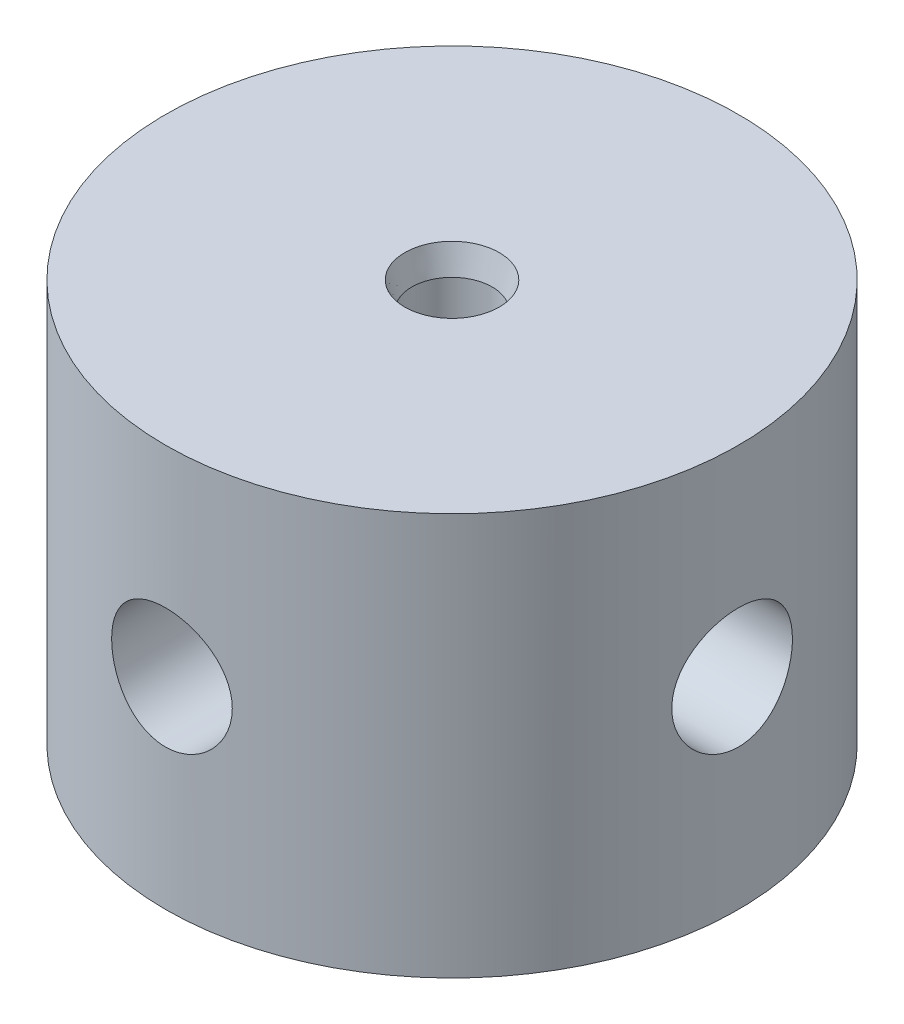
ISO-10303-21;
HEADER;
FILE_DESCRIPTION(('STEP AP214'),'2;1');
FILE_NAME('part.step','',(''),(''),'','','');
FILE_SCHEMA(('AUTOMOTIVE_DESIGN { 1 0 10303 214 1 1 1 1 }'));
ENDSEC;
DATA;
#1=APPLICATION_CONTEXT('core data for automotive mechanical design processes');
#2=APPLICATION_PROTOCOL_DEFINITION('international standard','automotive_design',2000,#1);
#3=PRODUCT_CONTEXT('',#1,'mechanical');
#4=PRODUCT('Part','Part','',(#3));
#5=PRODUCT_RELATED_PRODUCT_CATEGORY('part','',(#4));
#6=PRODUCT_DEFINITION_FORMATION('','',#4);
#7=PRODUCT_DEFINITION_CONTEXT('part definition',#1,'design');
#8=PRODUCT_DEFINITION('design','',#6,#7);
#9=PRODUCT_DEFINITION_SHAPE('','',#8);
#10=(LENGTH_UNIT() NAMED_UNIT(*) SI_UNIT(.MILLI.,.METRE.));
#11=(NAMED_UNIT(*) PLANE_ANGLE_UNIT() SI_UNIT($,.RADIAN.));
#12=(NAMED_UNIT(*) SI_UNIT($,.STERADIAN.) SOLID_ANGLE_UNIT());
#13=UNCERTAINTY_MEASURE_WITH_UNIT(LENGTH_MEASURE(1.E-05),#10,'distance_accuracy_value','');
#14=(GEOMETRIC_REPRESENTATION_CONTEXT(3) GLOBAL_UNCERTAINTY_ASSIGNED_CONTEXT((#13)) GLOBAL_UNIT_ASSIGNED_CONTEXT((#10,
#11,#12)) REPRESENTATION_CONTEXT('',''));
#15=CARTESIAN_POINT('',(0.,0.,0.));
#16=DIRECTION('',(0.,0.,1.));
#17=DIRECTION('',(1.,0.,0.));
#18=AXIS2_PLACEMENT_3D('',#15,#16,#17);
#19=CARTESIAN_POINT('',(0.,7.70570230503482,0.));
#20=DIRECTION('',(0.,1.,0.));
#21=DIRECTION('',(0.,0.,1.));
#22=AXIS2_PLACEMENT_3D('',#19,#20,#21);
#23=CONICAL_SURFACE('',#22,2.,0.261799387799143);
#24=CARTESIAN_POINT('',(0.,9.01192008768396,0.));
#25=DIRECTION('',(0.,1.,0.));
#26=DIRECTION('',(0.,0.,1.));
#27=AXIS2_PLACEMENT_3D('',#24,#25,#26);
#28=CIRCLE('',#27,2.35);
#29=CARTESIAN_POINT('',(0.,9.01192008768396,2.35));
#30=VERTEX_POINT('',#29);
#31=EDGE_CURVE('E89',#30,#30,#28,.T.);
#32=ORIENTED_EDGE('',*,*,#31,.T.);
#33=EDGE_LOOP('',(#32));
#34=FACE_BOUND('',#33,.T.);
#35=CARTESIAN_POINT('',(0.,7.70570230503482,0.));
#36=DIRECTION('',(0.,1.,0.));
#37=DIRECTION('',(0.,0.,1.));
#38=AXIS2_PLACEMENT_3D('',#35,#36,#37);
#39=CIRCLE('',#38,2.);
#40=CARTESIAN_POINT('',(0.,7.70570230503482,2.));
#41=VERTEX_POINT('',#40);
#42=EDGE_CURVE('E101',#41,#41,#39,.T.);
#43=ORIENTED_EDGE('',*,*,#42,.F.);
#44=EDGE_LOOP('',(#43));
#45=FACE_BOUND('',#44,.T.);
#46=ADVANCED_FACE('F31',(#34,#45),#23,.F.);
#47=CARTESIAN_POINT('',(-2.35,9.01192008768396,0.));
#48=DIRECTION('',(0.,1.,0.));
#49=DIRECTION('',(0.,0.,1.));
#50=AXIS2_PLACEMENT_3D('',#47,#48,#49);
#51=PLANE('',#50);
#52=CARTESIAN_POINT('',(0.,9.01192008768396,0.));
#53=DIRECTION('',(0.,1.,0.));
#54=DIRECTION('',(0.,0.,1.));
#55=AXIS2_PLACEMENT_3D('',#52,#53,#54);
#56=CIRCLE('',#55,14.25);
#57=CARTESIAN_POINT('',(0.,9.01192008768396,14.25));
#58=VERTEX_POINT('',#57);
#59=EDGE_CURVE('E92',#58,#58,#56,.T.);
#60=ORIENTED_EDGE('',*,*,#59,.T.);
#61=EDGE_LOOP('',(#60));
#62=FACE_BOUND('',#61,.T.);
#63=ORIENTED_EDGE('',*,*,#31,.F.);
#64=EDGE_LOOP('',(#63));
#65=FACE_BOUND('',#64,.T.);
#66=ADVANCED_FACE('F129',(#62,#65),#51,.T.);
#67=CARTESIAN_POINT('',(0.,20.798274686081,0.));
#68=DIRECTION('',(0.,1.,0.));
#69=DIRECTION('',(0.,0.,1.));
#70=AXIS2_PLACEMENT_3D('',#67,#68,#69);
#71=CYLINDRICAL_SURFACE('',#70,14.25);
#72=CARTESIAN_POINT('',(-3.00000000000005,-0.988079912316035,-13.930631715755));
#73=CARTESIAN_POINT('',(-2.99999407273185,-0.821584479864396,-13.9306350694233));
#74=CARTESIAN_POINT('',(-2.98609252354241,-0.655016304540398,-13.9336490686332));
#75=CARTESIAN_POINT('',(-2.93090795114804,-0.326605720671018,-13.9453592590967));
#76=CARTESIAN_POINT('',(-2.88960418647757,-0.164766988923008,-13.9540597545363));
#77=CARTESIAN_POINT('',(-2.78096413507837,0.149386333124839,-13.9761148771583));
#78=CARTESIAN_POINT('',(-2.71365521140457,0.301710739498108,-13.9894646108851));
#79=CARTESIAN_POINT('',(-2.55499233532879,0.592905119851587,-14.0193081761238));
#80=CARTESIAN_POINT('',(-2.46363925554748,0.731775581857834,-14.035801893527));
#81=CARTESIAN_POINT('',(-2.25795658766702,0.994298790749845,-14.0703635152151));
#82=CARTESIAN_POINT('',(-2.14332210398661,1.11771021327432,-14.0884502868546));
#83=CARTESIAN_POINT('',(-1.8949891381351,1.34370163048866,-14.1239945260068));
#84=CARTESIAN_POINT('',(-1.76128924195898,1.44628007871137,-14.1414519467228));
#85=CARTESIAN_POINT('',(-1.47701156458836,1.62864022199621,-14.1739751058444));
#86=CARTESIAN_POINT('',(-1.32628259484508,1.70819104516815,-14.1890159922531));
#87=CARTESIAN_POINT('',(-1.01322719350428,1.84074586707918,-14.21479878611));
#88=CARTESIAN_POINT('',(-0.850901968122824,1.89375262229081,-14.2255411399167));
#89=CARTESIAN_POINT('',(-0.521769054013513,1.97095909856941,-14.2413831830226));
#90=CARTESIAN_POINT('',(-0.355060987239144,1.99556685123942,-14.2465627205912));
#91=CARTESIAN_POINT('',(-0.0198076685782618,2.01655133138358,-14.2509717954661));
#92=CARTESIAN_POINT('',(0.148737386079496,2.01293106032487,-14.2502019653647));
#93=CARTESIAN_POINT('',(0.480071518580554,1.97786865735904,-14.2428604484779));
#94=CARTESIAN_POINT('',(0.64290945256736,1.94686619860381,-14.2363804530263));
#95=CARTESIAN_POINT('',(0.961018532741792,1.85861864055113,-14.2184506837522));
#96=CARTESIAN_POINT('',(1.11628935351906,1.80137241378643,-14.2070006964133));
#97=CARTESIAN_POINT('',(1.41609228375931,1.66186520665428,-14.180268362604));
#98=CARTESIAN_POINT('',(1.56054328432608,1.57943506614312,-14.1649602266178));
#99=CARTESIAN_POINT('',(1.83372413747655,1.39202561520243,-14.1321942006922));
#100=CARTESIAN_POINT('',(1.9624519932724,1.28704344539984,-14.1147360382706));
#101=CARTESIAN_POINT('',(2.20314494546534,1.05510799794787,-14.0791960848749));
#102=CARTESIAN_POINT('',(2.31473871266244,0.927769899734075,-14.0611087605331));
#103=CARTESIAN_POINT('',(2.51505310201785,0.656001598966922,-14.0266663568076));
#104=CARTESIAN_POINT('',(2.6037731927548,0.511570999419274,-14.0103113176752));
#105=CARTESIAN_POINT('',(2.75597009651015,0.209147377700451,-13.981172245478));
#106=CARTESIAN_POINT('',(2.81938126333301,0.051120361783404,-13.9683975242318));
#107=CARTESIAN_POINT('',(2.91863920179107,-0.273677852748964,-13.9479976801258));
#108=CARTESIAN_POINT('',(2.95448999266834,-0.440447772560281,-13.9403718064083));
#109=CARTESIAN_POINT('',(2.99704298467467,-0.774617130201403,-13.9312850369798));
#110=CARTESIAN_POINT('',(3.00428387028938,-0.941944952893327,-13.9297102240784));
#111=CARTESIAN_POINT('',(2.99086596152107,-1.27541705777999,-13.9325972645622));
#112=CARTESIAN_POINT('',(2.97020893245215,-1.44156141419293,-13.9370587359856));
#113=CARTESIAN_POINT('',(2.90204763754515,-1.76610394559504,-13.9514084749644));
#114=CARTESIAN_POINT('',(2.85483608001637,-1.92456645335632,-13.9612375421685));
#115=CARTESIAN_POINT('',(2.73522104221618,-2.23133220226323,-13.9851622510167));
#116=CARTESIAN_POINT('',(2.66281529884392,-2.37963452932444,-13.9992582759311));
#117=CARTESIAN_POINT('',(2.49366584734068,-2.66421298589082,-14.0303814452717));
#118=CARTESIAN_POINT('',(2.39658795441122,-2.80028611406093,-14.0474477309783));
#119=CARTESIAN_POINT('',(2.18129081640063,-3.05440770695595,-14.0824834094133));
#120=CARTESIAN_POINT('',(2.06306914825927,-3.17245410295399,-14.100452905479));
#121=CARTESIAN_POINT('',(1.80641133549868,-3.38924045197978,-14.1356432219504));
#122=CARTESIAN_POINT('',(1.66766322576946,-3.48761449486815,-14.1528459123941));
#123=CARTESIAN_POINT('',(1.37529727784636,-3.65965656177768,-14.1842391773599));
#124=CARTESIAN_POINT('',(1.22168010527678,-3.73332569107352,-14.1984298866247));
#125=CARTESIAN_POINT('',(0.904855274272693,-3.85334644673233,-14.2221233894864));
#126=CARTESIAN_POINT('',(0.741712482240362,-3.89986346129369,-14.231654506413));
#127=CARTESIAN_POINT('',(0.40970624090926,-3.96477960830722,-14.2450769586453));
#128=CARTESIAN_POINT('',(0.240843562060605,-3.98318251236515,-14.2489690504422));
#129=CARTESIAN_POINT('',(-0.0943259629639137,-3.99118896600825,-14.2506545057702));
#130=CARTESIAN_POINT('',(-0.260619374818223,-3.98134051011501,-14.2485639178517));
#131=CARTESIAN_POINT('',(-0.589124475083912,-3.93434247631924,-14.2387654654102));
#132=CARTESIAN_POINT('',(-0.751336226589696,-3.89719332070007,-14.2310576877731));
#133=CARTESIAN_POINT('',(-1.06668635807138,-3.79690267570119,-14.2108971315503));
#134=CARTESIAN_POINT('',(-1.21984867240174,-3.73383361676328,-14.1984575825559));
#135=CARTESIAN_POINT('',(-1.51349270412333,-3.58356622499668,-14.1701667219788));
#136=CARTESIAN_POINT('',(-1.65397328909193,-3.4963657401588,-14.1543151061404));
#137=CARTESIAN_POINT('',(-1.92095580956016,-3.29849623847961,-14.1205834502782));
#138=CARTESIAN_POINT('',(-2.04716599961986,-3.18743881198926,-14.1026724491366));
#139=CARTESIAN_POINT('',(-2.27934648720456,-2.94579807504841,-14.0670149775653));
#140=CARTESIAN_POINT('',(-2.38531194165915,-2.8152101056685,-14.0492685474691));
#141=CARTESIAN_POINT('',(-2.57523141623086,-2.53630360327344,-14.0157098350715));
#142=CARTESIAN_POINT('',(-2.65890154128328,-2.38778844032834,-13.9999237506872));
#143=CARTESIAN_POINT('',(-2.79996396176601,-2.07850943086071,-13.972398057534));
#144=CARTESIAN_POINT('',(-2.85737921903871,-1.91775643134492,-13.9606549151405));
#145=CARTESIAN_POINT('',(-2.93365323653366,-1.62863586204564,-13.9447939519178));
#146=CARTESIAN_POINT('',(-2.95848701414074,-1.50187425432427,-13.9395173008137));
#147=CARTESIAN_POINT('',(-2.99166234709938,-1.2461162376573,-13.9324349558807));
#148=CARTESIAN_POINT('',(-3.00000459384829,-1.11711992262917,-13.9306291165403));
#149=CARTESIAN_POINT('',(-3.00000000000005,-0.988079912316035,-13.930631715755));
#150=B_SPLINE_CURVE_WITH_KNOTS('',3,(#72,#73,#74,#75,#76,#77,#78,#79,#80,#81,#82,#83,#84,#85,
#86,#87,#88,#89,#90,#91,#92,#93,#94,#95,#96,#97,#98,#99,#100,#101,#102,#103,#104,#105,#106,#107,
#108,#109,#110,#111,#112,#113,#114,#115,#116,#117,#118,#119,#120,#121,#122,#123,#124,#125,#126,
#127,#128,#129,#130,#131,#132,#133,#134,#135,#136,#137,#138,#139,#140,#141,#142,#143,#144,#145,
#146,#147,#148,#149),.UNSPECIFIED.,.T.,.F.,(4,2,2,2,2,2,2,2,2,2,2,2,2,2,2,2,2,2,2,2,2,2,2,2,2,2,
2,2,2,2,2,2,2,2,2,2,2,2,4),(0.,0.499013580051084,0.998405308355624,1.49727299331846,
1.99612257566095,2.50198365804439,3.00788227764318,3.51868998702156,4.02944464049469,
4.53276573586809,5.03603331417135,5.53136396516304,6.02671589821407,6.52547111639667,
7.02428960914467,7.53273204167442,8.04118628572137,8.55095091695637,9.06064119302525,
9.56068764222809,10.0607024511563,10.5553107117371,11.0499634126291,11.5517109349612,
12.0535159940564,12.5639288263015,13.0743188201072,13.5815665933708,14.0887463116029,
14.5861551220043,15.0835562387187,15.5795767703218,16.0756415506538,16.5804948480431,
17.0854687687337,17.5965948233673,18.1072730011103,18.4940428743956,18.8807965322468),.UNSPECIFIED.);
#151=CARTESIAN_POINT('',(-3.00000000000005,-0.988079912316035,-13.930631715755));
#152=VERTEX_POINT('',#151);
#153=EDGE_CURVE('E10',#152,#152,#150,.T.);
#154=ORIENTED_EDGE('',*,*,#153,.F.);
#155=EDGE_LOOP('',(#154));
#156=FACE_BOUND('',#155,.T.);
#157=CARTESIAN_POINT('',(-13.930631715755,-0.988079912316035,3.));
#158=CARTESIAN_POINT('',(-13.9306350694233,-0.821584479864396,2.9999940727318));
#159=CARTESIAN_POINT('',(-13.9336490686332,-0.655016304540398,2.98609252354236));
#160=CARTESIAN_POINT('',(-13.9453592590967,-0.326605720671018,2.930907951148));
#161=CARTESIAN_POINT('',(-13.9540597545363,-0.164766988923008,2.88960418647752));
#162=CARTESIAN_POINT('',(-13.9761148771583,0.149386333124839,2.78096413507833));
#163=CARTESIAN_POINT('',(-13.9894646108851,0.301710739498109,2.71365521140452));
#164=CARTESIAN_POINT('',(-14.0193081761239,0.592905119851587,2.55499233532875));
#165=CARTESIAN_POINT('',(-14.035801893527,0.731775581857835,2.46363925554743));
#166=CARTESIAN_POINT('',(-14.0703635152151,0.994298790749846,2.25795658766697));
#167=CARTESIAN_POINT('',(-14.0884502868546,1.11771021327433,2.14332210398656));
#168=CARTESIAN_POINT('',(-14.1239945260068,1.34370163048866,1.89498913813505));
#169=CARTESIAN_POINT('',(-14.1414519467228,1.44628007871137,1.76128924195893));
#170=CARTESIAN_POINT('',(-14.1739751058444,1.62864022199621,1.47701156458831));
#171=CARTESIAN_POINT('',(-14.1890159922531,1.70819104516814,1.32628259484503));
#172=CARTESIAN_POINT('',(-14.21479878611,1.84074586707918,1.01322719350423));
#173=CARTESIAN_POINT('',(-14.2255411399167,1.89375262229081,0.850901968122774));
#174=CARTESIAN_POINT('',(-14.2413831830226,1.97095909856941,0.521769054013463));
#175=CARTESIAN_POINT('',(-14.2465627205912,1.99556685123942,0.355060987239094));
#176=CARTESIAN_POINT('',(-14.2509717954661,2.01655133138358,0.0198076685782125));
#177=CARTESIAN_POINT('',(-14.2502019653647,2.01293106032487,-0.148737386079545));
#178=CARTESIAN_POINT('',(-14.2428604484779,1.97786865735904,-0.480071518580603));
#179=CARTESIAN_POINT('',(-14.2363804530263,1.94686619860381,-0.642909452567409));
#180=CARTESIAN_POINT('',(-14.2184506837522,1.85861864055113,-0.96101853274184));
#181=CARTESIAN_POINT('',(-14.2070006964132,1.80137241378643,-1.11628935351911));
#182=CARTESIAN_POINT('',(-14.180268362604,1.66186520665428,-1.41609228375936));
#183=CARTESIAN_POINT('',(-14.1649602266178,1.57943506614312,-1.56054328432613));
#184=CARTESIAN_POINT('',(-14.1321942006921,1.39202561520243,-1.8337241374766));
#185=CARTESIAN_POINT('',(-14.1147360382706,1.28704344539984,-1.96245199327245));
#186=CARTESIAN_POINT('',(-14.0791960848749,1.05510799794787,-2.20314494546539));
#187=CARTESIAN_POINT('',(-14.0611087605331,0.927769899734076,-2.31473871266249));
#188=CARTESIAN_POINT('',(-14.0266663568076,0.656001598966924,-2.5150531020179));
#189=CARTESIAN_POINT('',(-14.0103113176752,0.511570999419275,-2.60377319275485));
#190=CARTESIAN_POINT('',(-13.981172245478,0.209147377700452,-2.7559700965102));
#191=CARTESIAN_POINT('',(-13.9683975242318,0.0511203617834047,-2.81938126333306));
#192=CARTESIAN_POINT('',(-13.9479976801258,-0.273677852748963,-2.91863920179112));
#193=CARTESIAN_POINT('',(-13.9403718064083,-0.44044777256028,-2.95448999266839));
#194=CARTESIAN_POINT('',(-13.9312850369798,-0.7746171302014,-2.99704298467472));
#195=CARTESIAN_POINT('',(-13.9297102240784,-0.941944952893325,-3.00428387028943));
#196=CARTESIAN_POINT('',(-13.9325972645622,-1.27541705777999,-2.99086596152112));
#197=CARTESIAN_POINT('',(-13.9370587359856,-1.44156141419293,-2.9702089324522));
#198=CARTESIAN_POINT('',(-13.9514084749644,-1.76610394559503,-2.9020476375452));
#199=CARTESIAN_POINT('',(-13.9612375421685,-1.92456645335632,-2.85483608001642));
#200=CARTESIAN_POINT('',(-13.9851622510167,-2.23133220226322,-2.73522104221623));
#201=CARTESIAN_POINT('',(-13.9992582759311,-2.37963452932444,-2.66281529884397));
#202=CARTESIAN_POINT('',(-14.0303814452717,-2.66421298589082,-2.49366584734073));
#203=CARTESIAN_POINT('',(-14.0474477309783,-2.80028611406092,-2.39658795441127));
#204=CARTESIAN_POINT('',(-14.0824834094133,-3.05440770695595,-2.18129081640068));
#205=CARTESIAN_POINT('',(-14.100452905479,-3.17245410295399,-2.06306914825932));
#206=CARTESIAN_POINT('',(-14.1356432219504,-3.38924045197978,-1.80641133549873));
#207=CARTESIAN_POINT('',(-14.1528459123941,-3.48761449486815,-1.66766322576951));
#208=CARTESIAN_POINT('',(-14.1842391773599,-3.65965656177767,-1.37529727784641));
#209=CARTESIAN_POINT('',(-14.1984298866247,-3.73332569107352,-1.22168010527683));
#210=CARTESIAN_POINT('',(-14.2221233894864,-3.85334644673233,-0.904855274272744));
#211=CARTESIAN_POINT('',(-14.231654506413,-3.89986346129369,-0.741712482240413));
#212=CARTESIAN_POINT('',(-14.2450769586453,-3.96477960830722,-0.409706240909311));
#213=CARTESIAN_POINT('',(-14.2489690504422,-3.98318251236515,-0.240843562060656));
#214=CARTESIAN_POINT('',(-14.2506545057702,-3.99118896600825,0.094325962963862));
#215=CARTESIAN_POINT('',(-14.2485639178517,-3.98134051011501,0.260619374818172));
#216=CARTESIAN_POINT('',(-14.2387654654102,-3.93434247631924,0.58912447508386));
#217=CARTESIAN_POINT('',(-14.2310576877731,-3.89719332070007,0.751336226589644));
#218=CARTESIAN_POINT('',(-14.2108971315503,-3.7969026757012,1.06668635807133));
#219=CARTESIAN_POINT('',(-14.1984575825559,-3.73383361676328,1.21984867240169));
#220=CARTESIAN_POINT('',(-14.1701667219788,-3.58356622499668,1.51349270412328));
#221=CARTESIAN_POINT('',(-14.1543151061404,-3.4963657401588,1.65397328909188));
#222=CARTESIAN_POINT('',(-14.1205834502782,-3.29849623847962,1.92095580956011));
#223=CARTESIAN_POINT('',(-14.1026724491366,-3.18743881198926,2.04716599961981));
#224=CARTESIAN_POINT('',(-14.0670149775653,-2.94579807504842,2.2793464872045));
#225=CARTESIAN_POINT('',(-14.0492685474691,-2.8152101056685,2.3853119416591));
#226=CARTESIAN_POINT('',(-14.0157098350715,-2.53630360327345,2.57523141623081));
#227=CARTESIAN_POINT('',(-13.9999237506872,-2.38778844032834,2.65890154128322));
#228=CARTESIAN_POINT('',(-13.972398057534,-2.07850943086072,2.79996396176596));
#229=CARTESIAN_POINT('',(-13.9606549151405,-1.91775643134492,2.85737921903866));
#230=CARTESIAN_POINT('',(-13.9447939519178,-1.62863586204564,2.93365323653361));
#231=CARTESIAN_POINT('',(-13.9395173008137,-1.50187425432428,2.95848701414069));
#232=CARTESIAN_POINT('',(-13.9324349558807,-1.24611623765731,2.99166234709933));
#233=CARTESIAN_POINT('',(-13.9306291165403,-1.11711992262917,3.00000459384824));
#234=CARTESIAN_POINT('',(-13.930631715755,-0.988079912316035,3.));
#235=B_SPLINE_CURVE_WITH_KNOTS('',3,(#157,#158,#159,#160,#161,#162,#163,#164,#165,#166,#167,
#168,#169,#170,#171,#172,#173,#174,#175,#176,#177,#178,#179,#180,#181,#182,#183,#184,#185,#186,
#187,#188,#189,#190,#191,#192,#193,#194,#195,#196,#197,#198,#199,#200,#201,#202,#203,#204,#205,
#206,#207,#208,#209,#210,#211,#212,#213,#214,#215,#216,#217,#218,#219,#220,#221,#222,#223,#224,
#225,#226,#227,#228,#229,#230,#231,#232,#233,#234),.UNSPECIFIED.,.T.,.F.,(4,2,2,2,2,2,2,2,2,2,2,
2,2,2,2,2,2,2,2,2,2,2,2,2,2,2,2,2,2,2,2,2,2,2,2,2,2,2,4),(0.,0.499013580051084,
0.998405308355624,1.49727299331846,1.99612257566095,2.50198365804439,3.00788227764318,
3.51868998702156,4.02944464049469,4.53276573586809,5.03603331417135,5.53136396516304,
6.02671589821406,6.52547111639667,7.02428960914467,7.53273204167442,8.04118628572136,
8.55095091695637,9.06064119302525,9.56068764222808,10.0607024511563,10.5553107117371,
11.0499634126291,11.5517109349612,12.0535159940564,12.5639288263015,13.0743188201072,
13.5815665933708,14.0887463116028,14.5861551220043,15.0835562387187,15.5795767703218,
16.0756415506538,16.5804948480431,17.0854687687337,17.5965948233673,18.1072730011103,
18.4940428743956,18.8807965322468),.UNSPECIFIED.);
#236=CARTESIAN_POINT('',(-13.930631715755,-0.988079912316035,3.));
#237=VERTEX_POINT('',#236);
#238=EDGE_CURVE('E41',#237,#237,#235,.T.);
#239=ORIENTED_EDGE('',*,*,#238,.F.);
#240=EDGE_LOOP('',(#239));
#241=FACE_BOUND('',#240,.T.);
#242=CARTESIAN_POINT('',(0.,-3.98807991231604,14.25));
#243=CARTESIAN_POINT('',(0.166541537110377,-3.9880740191788,14.2499969169943));
#244=CARTESIAN_POINT('',(0.33315572954686,-3.97416503119347,14.2470506101673));
#245=CARTESIAN_POINT('',(0.661661846516614,-3.91894823597891,14.2355816081482));
#246=CARTESIAN_POINT('',(0.82355013232205,-3.87761986925357,14.2270547286168));
#247=CARTESIAN_POINT('',(1.13780843153495,-3.76890789935218,14.2053752165545));
#248=CARTESIAN_POINT('',(1.29018784087872,-3.70155050518824,14.1922272382771));
#249=CARTESIAN_POINT('',(1.58147504334523,-3.54277335245951,14.1627291587602));
#250=CARTESIAN_POINT('',(1.7203833865114,-3.45135457692287,14.1463791883451));
#251=CARTESIAN_POINT('',(1.98286658497172,-3.24560438694884,14.1119990985041));
#252=CARTESIAN_POINT('',(2.10621147716549,-3.13098283952237,14.0939494300954));
#253=CARTESIAN_POINT('',(2.33207370137345,-2.88270403449109,14.0583439878926));
#254=CARTESIAN_POINT('',(2.43458928269985,-2.74904517841954,14.0407882557203));
#255=CARTESIAN_POINT('',(2.61688141997284,-2.46480619124578,14.0079665337392));
#256=CARTESIAN_POINT('',(2.69641616149995,-2.31406782044963,13.9927256416312));
#257=CARTESIAN_POINT('',(2.82893869363976,-2.00099211462074,13.9665385432927));
#258=CARTESIAN_POINT('',(2.88192940895821,-1.83865605971109,13.9555918639408));
#259=CARTESIAN_POINT('',(2.95910567697577,-1.50947869422066,13.939431150953));
#260=CARTESIAN_POINT('',(2.98369675724527,-1.34273650136098,13.9341364952718));
#261=CARTESIAN_POINT('',(3.00463605190015,-1.00741552689891,13.9296369439431));
#262=CARTESIAN_POINT('',(3.00098747442181,-0.838836956089055,13.9304313565534));
#263=CARTESIAN_POINT('',(2.96587805197879,-0.507621726993377,13.9379470751783));
#264=CARTESIAN_POINT('',(2.93488549448466,-0.344932824077677,13.944568582696));
#265=CARTESIAN_POINT('',(2.84670855903369,-0.0271165926352235,13.9628349197759));
#266=CARTESIAN_POINT('',(2.78952280910326,0.128010339331974,13.9744800124667));
#267=CARTESIAN_POINT('',(2.65014513786708,0.427630413880438,14.0015814064261));
#268=CARTESIAN_POINT('',(2.56777067374655,0.572036035113901,14.017065367634));
#269=CARTESIAN_POINT('',(2.38048243086389,0.845149276629205,14.0500825319901));
#270=CARTESIAN_POINT('',(2.27556579480883,0.97385490364095,14.0676159947907));
#271=CARTESIAN_POINT('',(2.04367978902858,1.21461351030631,14.1031866512733));
#272=CARTESIAN_POINT('',(1.91631154618318,1.32628221709948,14.1212269085634));
#273=CARTESIAN_POINT('',(1.64445525927998,1.52673384625625,14.1554585365818));
#274=CARTESIAN_POINT('',(1.49996694780605,1.61551641106862,14.1716498784223));
#275=CARTESIAN_POINT('',(1.19752191990473,1.76775973167511,14.2004059825869));
#276=CARTESIAN_POINT('',(1.03954062073083,1.83117301948902,14.2129639345088));
#277=CARTESIAN_POINT('',(0.714842583634358,1.93044892017468,14.2329872639561));
#278=CARTESIAN_POINT('',(0.548127023805364,1.96631523846608,14.2404533263905));
#279=CARTESIAN_POINT('',(0.213991768716062,2.00892684727819,14.2493551082051));
#280=CARTESIAN_POINT('',(0.0466418821643147,2.01619748342876,14.2508996021877));
#281=CARTESIAN_POINT('',(-0.286881252007021,2.00283118318597,14.2480878367658));
#282=CARTESIAN_POINT('',(-0.453054572619357,1.98219599355968,14.2437319466963));
#283=CARTESIAN_POINT('',(-0.77778742790824,1.91403983157266,14.2296772315481));
#284=CARTESIAN_POINT('',(-0.936406787534411,1.86679172299681,14.2200326577882));
#285=CARTESIAN_POINT('',(-1.24347024534595,1.7470516833623,14.1964790234462));
#286=CARTESIAN_POINT('',(-1.39191352075282,1.6745577139458,14.1825696185314));
#287=CARTESIAN_POINT('',(-1.67660282086847,1.50527046847169,14.151759590255));
#288=CARTESIAN_POINT('',(-1.81265913123308,1.40816512862925,14.134821444206));
#289=CARTESIAN_POINT('',(-2.06673421405954,1.19282560948012,14.0999143839684));
#290=CARTESIAN_POINT('',(-2.18475082481827,1.07458890167134,14.0819453466021));
#291=CARTESIAN_POINT('',(-2.40145142835673,0.817940551052483,14.0466300400284));
#292=CARTESIAN_POINT('',(-2.49977299949404,0.679220339845856,14.0292995329839));
#293=CARTESIAN_POINT('',(-2.67172307298231,0.386926258736484,13.9975737923331));
#294=CARTESIAN_POINT('',(-2.74535261289916,0.233353013311766,13.9831784354011));
#295=CARTESIAN_POINT('',(-2.86535107342834,-0.0834824830270061,13.9590835341467));
#296=CARTESIAN_POINT('',(-2.91186854405661,-0.246686435609178,13.9493584535498));
#297=CARTESIAN_POINT('',(-2.97676496342319,-0.578823391289108,13.9356553622011));
#298=CARTESIAN_POINT('',(-2.99514803454043,-0.747755551355617,13.9316765094909));
#299=CARTESIAN_POINT('',(-3.00308852758949,-1.08290650281042,13.929966628784));
#300=CARTESIAN_POINT('',(-2.99321966856087,-1.2491113278271,13.932111247594));
#301=CARTESIAN_POINT('',(-2.94621169242545,-1.57743376723272,13.9421269515388));
#302=CARTESIAN_POINT('',(-2.90907284904207,-1.73955142262987,13.9499979791944));
#303=CARTESIAN_POINT('',(-2.80884694961555,-2.05468248914857,13.9705212377295));
#304=CARTESIAN_POINT('',(-2.74583751325376,-2.20772158011523,13.9831591573303));
#305=CARTESIAN_POINT('',(-2.59572800595638,-2.50114346193073,14.0117989214057));
#306=CARTESIAN_POINT('',(-2.5086256411844,-2.64152504599702,14.0278010861481));
#307=CARTESIAN_POINT('',(-2.31087450528686,-2.90848814202123,14.0617418217277));
#308=CARTESIAN_POINT('',(-2.1998143863587,-3.0347611034465,14.0797111056862));
#309=CARTESIAN_POINT('',(-1.95814113619446,-3.26706697864975,14.1153488491848));
#310=CARTESIAN_POINT('',(-1.82752350639616,-3.37309522299666,14.1330172384697));
#311=CARTESIAN_POINT('',(-1.54858348059118,-3.56309540969711,14.1663096766607));
#312=CARTESIAN_POINT('',(-1.4000699765315,-3.64679168753194,14.1819070783792));
#313=CARTESIAN_POINT('',(-1.09079180710252,-3.78790343928444,14.2090352755561));
#314=CARTESIAN_POINT('',(-0.930037904806181,-3.84534169775709,14.2205695946224));
#315=CARTESIAN_POINT('',(-0.640858885658901,-3.92166995373646,14.2361315560418));
#316=CARTESIAN_POINT('',(-0.514036351019267,-3.94652758853575,14.2413008144957));
#317=CARTESIAN_POINT('',(-0.25815704003422,-3.97973453495863,14.2482361660742));
#318=CARTESIAN_POINT('',(-0.12910034968661,-3.98808448058225,14.250002389897));
#319=CARTESIAN_POINT('',(0.,-3.98807991231604,14.25));
#320=B_SPLINE_CURVE_WITH_KNOTS('',3,(#242,#243,#244,#245,#246,#247,#248,#249,#250,#251,#252,
#253,#254,#255,#256,#257,#258,#259,#260,#261,#262,#263,#264,#265,#266,#267,#268,#269,#270,#271,
#272,#273,#274,#275,#276,#277,#278,#279,#280,#281,#282,#283,#284,#285,#286,#287,#288,#289,#290,
#291,#292,#293,#294,#295,#296,#297,#298,#299,#300,#301,#302,#303,#304,#305,#306,#307,#308,#309,
#310,#311,#312,#313,#314,#315,#316,#317,#318,#319),.UNSPECIFIED.,.T.,.F.,(4,2,2,2,2,2,2,2,2,2,2,
2,2,2,2,2,2,2,2,2,2,2,2,2,2,2,2,2,2,2,2,2,2,2,2,2,2,2,4),(0.,0.499152175546915,0.99867904714604,
1.49770424288387,1.99670905410247,2.50238879598809,3.00811102230727,3.51897553623579,
4.02978374908917,4.53320408629235,5.03656723380293,5.53147367137181,6.02640603461657,
6.52501377627615,7.02368475539701,7.53232315299178,8.04096949658586,8.5505631569658,
9.06008825847123,9.56020764245239,10.0602957228753,10.5553473403696,11.0504389377396,
11.5521530284449,12.0539271926631,12.5642242165084,13.0744997948458,13.5819525758305,
14.089330995427,14.5864794863132,15.0836229871223,15.5792856803964,16.0749955809124,
16.5800116441855,17.0851440487547,17.5962501118787,18.1069118333465,18.4938615193156,
18.8807963436725),.UNSPECIFIED.);
#321=CARTESIAN_POINT('',(0.,-3.98807991231604,14.25));
#322=VERTEX_POINT('',#321);
#323=EDGE_CURVE('E45',#322,#322,#320,.T.);
#324=ORIENTED_EDGE('',*,*,#323,.F.);
#325=EDGE_LOOP('',(#324));
#326=FACE_BOUND('',#325,.T.);
#327=CARTESIAN_POINT('',(13.930631715755,-0.988079912316035,-3.));
#328=CARTESIAN_POINT('',(13.9306350694233,-0.821584479864396,-2.9999940727318));
#329=CARTESIAN_POINT('',(13.9336490686332,-0.655016304540398,-2.98609252354236));
#330=CARTESIAN_POINT('',(13.9453592590967,-0.326605720671018,-2.930907951148));
#331=CARTESIAN_POINT('',(13.9540597545363,-0.164766988923008,-2.88960418647752));
#332=CARTESIAN_POINT('',(13.9761148771583,0.149386333124839,-2.78096413507833));
#333=CARTESIAN_POINT('',(13.9894646108851,0.301710739498109,-2.71365521140452));
#334=CARTESIAN_POINT('',(14.0193081761239,0.592905119851587,-2.55499233532875));
#335=CARTESIAN_POINT('',(14.035801893527,0.731775581857835,-2.46363925554743));
#336=CARTESIAN_POINT('',(14.0703635152151,0.994298790749846,-2.25795658766697));
#337=CARTESIAN_POINT('',(14.0884502868546,1.11771021327433,-2.14332210398656));
#338=CARTESIAN_POINT('',(14.1239945260068,1.34370163048866,-1.89498913813505));
#339=CARTESIAN_POINT('',(14.1414519467228,1.44628007871137,-1.76128924195893));
#340=CARTESIAN_POINT('',(14.1739751058444,1.62864022199621,-1.47701156458831));
#341=CARTESIAN_POINT('',(14.1890159922531,1.70819104516814,-1.32628259484503));
#342=CARTESIAN_POINT('',(14.21479878611,1.84074586707918,-1.01322719350423));
#343=CARTESIAN_POINT('',(14.2255411399167,1.89375262229081,-0.850901968122774));
#344=CARTESIAN_POINT('',(14.2413831830226,1.97095909856941,-0.521769054013463));
#345=CARTESIAN_POINT('',(14.2465627205912,1.99556685123942,-0.355060987239094));
#346=CARTESIAN_POINT('',(14.2509717954661,2.01655133138358,-0.0198076685782125));
#347=CARTESIAN_POINT('',(14.2502019653647,2.01293106032487,0.148737386079545));
#348=CARTESIAN_POINT('',(14.2428604484779,1.97786865735904,0.480071518580603));
#349=CARTESIAN_POINT('',(14.2363804530263,1.94686619860381,0.642909452567409));
#350=CARTESIAN_POINT('',(14.2184506837522,1.85861864055113,0.96101853274184));
#351=CARTESIAN_POINT('',(14.2070006964132,1.80137241378643,1.11628935351911));
#352=CARTESIAN_POINT('',(14.180268362604,1.66186520665428,1.41609228375936));
#353=CARTESIAN_POINT('',(14.1649602266178,1.57943506614312,1.56054328432613));
#354=CARTESIAN_POINT('',(14.1321942006921,1.39202561520243,1.8337241374766));
#355=CARTESIAN_POINT('',(14.1147360382706,1.28704344539984,1.96245199327245));
#356=CARTESIAN_POINT('',(14.0791960848749,1.05510799794787,2.20314494546539));
#357=CARTESIAN_POINT('',(14.0611087605331,0.927769899734076,2.31473871266249));
#358=CARTESIAN_POINT('',(14.0266663568076,0.656001598966924,2.5150531020179));
#359=CARTESIAN_POINT('',(14.0103113176752,0.511570999419275,2.60377319275485));
#360=CARTESIAN_POINT('',(13.981172245478,0.209147377700452,2.7559700965102));
#361=CARTESIAN_POINT('',(13.9683975242318,0.0511203617834047,2.81938126333306));
#362=CARTESIAN_POINT('',(13.9479976801258,-0.273677852748963,2.91863920179112));
#363=CARTESIAN_POINT('',(13.9403718064083,-0.44044777256028,2.95448999266839));
#364=CARTESIAN_POINT('',(13.9312850369798,-0.7746171302014,2.99704298467472));
#365=CARTESIAN_POINT('',(13.9297102240784,-0.941944952893325,3.00428387028943));
#366=CARTESIAN_POINT('',(13.9325972645622,-1.27541705777999,2.99086596152112));
#367=CARTESIAN_POINT('',(13.9370587359856,-1.44156141419293,2.9702089324522));
#368=CARTESIAN_POINT('',(13.9514084749644,-1.76610394559503,2.9020476375452));
#369=CARTESIAN_POINT('',(13.9612375421685,-1.92456645335632,2.85483608001642));
#370=CARTESIAN_POINT('',(13.9851622510167,-2.23133220226322,2.73522104221623));
#371=CARTESIAN_POINT('',(13.9992582759311,-2.37963452932444,2.66281529884397));
#372=CARTESIAN_POINT('',(14.0303814452717,-2.66421298589082,2.49366584734073));
#373=CARTESIAN_POINT('',(14.0474477309783,-2.80028611406092,2.39658795441127));
#374=CARTESIAN_POINT('',(14.0824834094133,-3.05440770695595,2.18129081640068));
#375=CARTESIAN_POINT('',(14.100452905479,-3.17245410295399,2.06306914825932));
#376=CARTESIAN_POINT('',(14.1356432219504,-3.38924045197978,1.80641133549873));
#377=CARTESIAN_POINT('',(14.1528459123941,-3.48761449486815,1.66766322576951));
#378=CARTESIAN_POINT('',(14.1842391773599,-3.65965656177767,1.37529727784641));
#379=CARTESIAN_POINT('',(14.1984298866247,-3.73332569107352,1.22168010527683));
#380=CARTESIAN_POINT('',(14.2221233894864,-3.85334644673233,0.904855274272744));
#381=CARTESIAN_POINT('',(14.231654506413,-3.89986346129369,0.741712482240413));
#382=CARTESIAN_POINT('',(14.2450769586453,-3.96477960830722,0.409706240909311));
#383=CARTESIAN_POINT('',(14.2489690504422,-3.98318251236515,0.240843562060656));
#384=CARTESIAN_POINT('',(14.2506545057702,-3.99118896600825,-0.094325962963862));
#385=CARTESIAN_POINT('',(14.2485639178517,-3.98134051011501,-0.260619374818172));
#386=CARTESIAN_POINT('',(14.2387654654102,-3.93434247631924,-0.58912447508386));
#387=CARTESIAN_POINT('',(14.2310576877731,-3.89719332070007,-0.751336226589644));
#388=CARTESIAN_POINT('',(14.2108971315503,-3.7969026757012,-1.06668635807133));
#389=CARTESIAN_POINT('',(14.1984575825559,-3.73383361676328,-1.21984867240169));
#390=CARTESIAN_POINT('',(14.1701667219788,-3.58356622499668,-1.51349270412328));
#391=CARTESIAN_POINT('',(14.1543151061404,-3.4963657401588,-1.65397328909188));
#392=CARTESIAN_POINT('',(14.1205834502782,-3.29849623847962,-1.92095580956011));
#393=CARTESIAN_POINT('',(14.1026724491366,-3.18743881198926,-2.04716599961981));
#394=CARTESIAN_POINT('',(14.0670149775653,-2.94579807504842,-2.2793464872045));
#395=CARTESIAN_POINT('',(14.0492685474691,-2.8152101056685,-2.3853119416591));
#396=CARTESIAN_POINT('',(14.0157098350715,-2.53630360327345,-2.57523141623081));
#397=CARTESIAN_POINT('',(13.9999237506872,-2.38778844032834,-2.65890154128322));
#398=CARTESIAN_POINT('',(13.972398057534,-2.07850943086072,-2.79996396176596));
#399=CARTESIAN_POINT('',(13.9606549151405,-1.91775643134492,-2.85737921903866));
#400=CARTESIAN_POINT('',(13.9447939519178,-1.62863586204564,-2.93365323653361));
#401=CARTESIAN_POINT('',(13.9395173008137,-1.50187425432428,-2.95848701414069));
#402=CARTESIAN_POINT('',(13.9324349558807,-1.24611623765731,-2.99166234709933));
#403=CARTESIAN_POINT('',(13.9306291165403,-1.11711992262917,-3.00000459384824));
#404=CARTESIAN_POINT('',(13.930631715755,-0.988079912316035,-3.));
#405=B_SPLINE_CURVE_WITH_KNOTS('',3,(#327,#328,#329,#330,#331,#332,#333,#334,#335,#336,#337,
#338,#339,#340,#341,#342,#343,#344,#345,#346,#347,#348,#349,#350,#351,#352,#353,#354,#355,#356,
#357,#358,#359,#360,#361,#362,#363,#364,#365,#366,#367,#368,#369,#370,#371,#372,#373,#374,#375,
#376,#377,#378,#379,#380,#381,#382,#383,#384,#385,#386,#387,#388,#389,#390,#391,#392,#393,#394,
#395,#396,#397,#398,#399,#400,#401,#402,#403,#404),.UNSPECIFIED.,.T.,.F.,(4,2,2,2,2,2,2,2,2,2,2,
2,2,2,2,2,2,2,2,2,2,2,2,2,2,2,2,2,2,2,2,2,2,2,2,2,2,2,4),(0.,0.499013580051084,
0.998405308355624,1.49727299331846,1.99612257566095,2.50198365804439,3.00788227764318,
3.51868998702156,4.02944464049469,4.53276573586809,5.03603331417135,5.53136396516304,
6.02671589821406,6.52547111639667,7.02428960914467,7.53273204167442,8.04118628572136,
8.55095091695637,9.06064119302525,9.56068764222808,10.0607024511563,10.5553107117371,
11.0499634126291,11.5517109349612,12.0535159940564,12.5639288263015,13.0743188201072,
13.5815665933708,14.0887463116028,14.5861551220043,15.0835562387187,15.5795767703218,
16.0756415506538,16.5804948480431,17.0854687687337,17.5965948233673,18.1072730011103,
18.4940428743956,18.8807965322468),.UNSPECIFIED.);
#406=CARTESIAN_POINT('',(13.930631715755,-0.988079912316035,-3.));
#407=VERTEX_POINT('',#406);
#408=EDGE_CURVE('E49',#407,#407,#405,.T.);
#409=ORIENTED_EDGE('',*,*,#408,.F.);
#410=EDGE_LOOP('',(#409));
#411=FACE_BOUND('',#410,.T.);
#412=CARTESIAN_POINT('',(0.,-10.988079912316,0.));
#413=DIRECTION('',(0.,1.,0.));
#414=DIRECTION('',(0.,0.,1.));
#415=AXIS2_PLACEMENT_3D('',#412,#413,#414);
#416=CIRCLE('',#415,14.25);
#417=CARTESIAN_POINT('',(0.,-10.988079912316,-14.25));
#418=VERTEX_POINT('',#417);
#419=EDGE_CURVE('E95',#418,#418,#416,.T.);
#420=ORIENTED_EDGE('',*,*,#419,.T.);
#421=EDGE_LOOP('',(#420));
#422=FACE_BOUND('',#421,.T.);
#423=ORIENTED_EDGE('',*,*,#59,.F.);
#424=EDGE_LOOP('',(#423));
#425=FACE_BOUND('',#424,.T.);
#426=ADVANCED_FACE('F58',(#156,#241,#326,#411,#422,#425),#71,.T.);
#427=CARTESIAN_POINT('',(0.,-10.988079912316,0.));
#428=DIRECTION('',(0.,-1.,0.));
#429=DIRECTION('',(0.,0.,-1.));
#430=AXIS2_PLACEMENT_3D('',#427,#428,#429);
#431=CONICAL_SURFACE('',#430,14.25,1.30899693899575);
#432=CARTESIAN_POINT('',(0.,-7.70570230503482,0.));
#433=DIRECTION('',(0.,1.,0.));
#434=DIRECTION('',(0.,0.,1.));
#435=AXIS2_PLACEMENT_3D('',#432,#433,#434);
#436=CIRCLE('',#435,2.);
#437=CARTESIAN_POINT('',(0.,-7.70570230503482,-2.));
#438=VERTEX_POINT('',#437);
#439=EDGE_CURVE('E98',#438,#438,#436,.T.);
#440=CARTESIAN_POINT('',(0.,-7.70570230503482,-2.));
#441=CARTESIAN_POINT('',(0.,-7.739893738444,-2.12760416666667));
#442=CARTESIAN_POINT('',(0.,-7.77408517185318,-2.25520833333333));
#443=CARTESIAN_POINT('',(0.,-7.84246803867154,-2.51041666666667));
#444=CARTESIAN_POINT('',(0.,-7.87665947208072,-2.63802083333333));
#445=CARTESIAN_POINT('',(0.,-7.94504233889907,-2.89322916666667));
#446=CARTESIAN_POINT('',(0.,-7.97923377230825,-3.02083333333333));
#447=CARTESIAN_POINT('',(0.,-8.04761663912661,-3.27604166666667));
#448=CARTESIAN_POINT('',(0.,-8.08180807253579,-3.40364583333333));
#449=CARTESIAN_POINT('',(0.,-8.15019093935415,-3.65885416666667));
#450=CARTESIAN_POINT('',(0.,-8.18438237276333,-3.78645833333333));
#451=CARTESIAN_POINT('',(0.,-8.25276523958169,-4.04166666666667));
#452=CARTESIAN_POINT('',(0.,-8.28695667299087,-4.16927083333333));
#453=CARTESIAN_POINT('',(0.,-8.35533953980923,-4.42447916666667));
#454=CARTESIAN_POINT('',(0.,-8.38953097321841,-4.55208333333334));
#455=CARTESIAN_POINT('',(0.,-8.45791384003677,-4.80729166666667));
#456=CARTESIAN_POINT('',(0.,-8.49210527344594,-4.93489583333334));
#457=CARTESIAN_POINT('',(0.,-8.5604881402643,-5.19010416666667));
#458=CARTESIAN_POINT('',(0.,-8.59467957367348,-5.31770833333334));
#459=CARTESIAN_POINT('',(0.,-8.66306244049184,-5.57291666666667));
#460=CARTESIAN_POINT('',(0.,-8.69725387390102,-5.70052083333333));
#461=CARTESIAN_POINT('',(0.,-8.76563674071938,-5.95572916666667));
#462=CARTESIAN_POINT('',(0.,-8.79982817412856,-6.08333333333334));
#463=CARTESIAN_POINT('',(0.,-8.86821104094692,-6.33854166666667));
#464=CARTESIAN_POINT('',(0.,-8.9024024743561,-6.46614583333334));
#465=CARTESIAN_POINT('',(0.,-8.97078534117446,-6.72135416666667));
#466=CARTESIAN_POINT('',(0.,-9.00497677458364,-6.84895833333334));
#467=CARTESIAN_POINT('',(0.,-9.07335964140199,-7.10416666666667));
#468=CARTESIAN_POINT('',(0.,-9.10755107481117,-7.23177083333334));
#469=CARTESIAN_POINT('',(0.,-9.17593394162953,-7.48697916666667));
#470=CARTESIAN_POINT('',(0.,-9.21012537503871,-7.61458333333334));
#471=CARTESIAN_POINT('',(0.,-9.27850824185707,-7.86979166666667));
#472=CARTESIAN_POINT('',(0.,-9.31269967526625,-7.99739583333334));
#473=CARTESIAN_POINT('',(0.,-9.38108254208461,-8.25260416666667));
#474=CARTESIAN_POINT('',(0.,-9.41527397549379,-8.38020833333334));
#475=CARTESIAN_POINT('',(0.,-9.48365684231215,-8.63541666666667));
#476=CARTESIAN_POINT('',(0.,-9.51784827572133,-8.76302083333334));
#477=CARTESIAN_POINT('',(0.,-9.58623114253968,-9.01822916666667));
#478=CARTESIAN_POINT('',(0.,-9.62042257594886,-9.14583333333334));
#479=CARTESIAN_POINT('',(0.,-9.68880544276722,-9.40104166666667));
#480=CARTESIAN_POINT('',(0.,-9.7229968761764,-9.52864583333334));
#481=CARTESIAN_POINT('',(0.,-9.79137974299476,-9.78385416666667));
#482=CARTESIAN_POINT('',(0.,-9.82557117640394,-9.91145833333334));
#483=CARTESIAN_POINT('',(0.,-9.8939540432223,-10.1666666666667));
#484=CARTESIAN_POINT('',(0.,-9.92814547663148,-10.2942708333333));
#485=CARTESIAN_POINT('',(0.,-9.99652834344984,-10.5494791666667));
#486=CARTESIAN_POINT('',(0.,-10.030719776859,-10.6770833333333));
#487=CARTESIAN_POINT('',(0.,-10.0991026436774,-10.9322916666667));
#488=CARTESIAN_POINT('',(0.,-10.1332940770866,-11.0598958333333));
#489=CARTESIAN_POINT('',(0.,-10.2016769439049,-11.3151041666667));
#490=CARTESIAN_POINT('',(0.,-10.2358683773141,-11.4427083333333));
#491=CARTESIAN_POINT('',(0.,-10.3042512441325,-11.6979166666667));
#492=CARTESIAN_POINT('',(0.,-10.3384426775416,-11.8255208333333));
#493=CARTESIAN_POINT('',(0.,-10.40682554436,-12.0807291666667));
#494=CARTESIAN_POINT('',(0.,-10.4410169777692,-12.2083333333333));
#495=CARTESIAN_POINT('',(0.,-10.5093998445875,-12.4635416666667));
#496=CARTESIAN_POINT('',(0.,-10.5435912779967,-12.5911458333333));
#497=CARTESIAN_POINT('',(0.,-10.6119741448151,-12.8463541666667));
#498=CARTESIAN_POINT('',(0.,-10.6461655782242,-12.9739583333333));
#499=CARTESIAN_POINT('',(0.,-10.7145484450426,-13.2291666666667));
#500=CARTESIAN_POINT('',(0.,-10.7487398784518,-13.3567708333333));
#501=CARTESIAN_POINT('',(0.,-10.8171227452701,-13.6119791666667));
#502=CARTESIAN_POINT('',(0.,-10.8513141786793,-13.7395833333333));
#503=CARTESIAN_POINT('',(0.,-10.9196970454977,-13.9947916666667));
#504=CARTESIAN_POINT('',(0.,-10.9538884789069,-14.1223958333333));
#505=CARTESIAN_POINT('',(0.,-10.988079912316,-14.25));
#506=B_SPLINE_CURVE_WITH_KNOTS('',3,(#440,#441,#442,#443,#444,#445,#446,#447,#448,#449,#450,
#451,#452,#453,#454,#455,#456,#457,#458,#459,#460,#461,#462,#463,#464,#465,#466,#467,#468,#469,
#470,#471,#472,#473,#474,#475,#476,#477,#478,#479,#480,#481,#482,#483,#484,#485,#486,#487,#488,
#489,#490,#491,#492,#493,#494,#495,#496,#497,#498,#499,#500,#501,#502,#503,#504,#505),
.UNSPECIFIED.,.F.,.F.,(4,2,2,2,2,2,2,2,2,2,2,2,2,2,2,2,2,2,2,2,2,2,2,2,2,2,2,2,2,2,2,2,4),(0.,
0.396316662813234,0.792633325626468,1.18894998843971,1.58526665125294,1.98158331406617,
2.37789997687941,2.77421663969265,3.17053330250588,3.56684996531911,3.96316662813235,
4.35948329094558,4.75579995375882,5.15211661657205,5.54843327938529,5.94474994219852,
6.34106660501176,6.73738326782499,7.13369993063823,7.53001659345146,7.9263332562647,
8.32264991907793,8.71896658189117,9.1152832447044,9.51159990751764,9.90791657033087,
10.3042332331441,10.7005498959573,11.0968665587706,11.4931832215838,11.889499884397,
12.2858165472103,12.6821332100235),.UNSPECIFIED.);
#507=EDGE_CURVE('BSEAM141',#438,#418,#506,.T.);
#508=ORIENTED_EDGE('',*,*,#439,.T.);
#509=ORIENTED_EDGE('',*,*,#419,.F.);
#510=ORIENTED_EDGE('',*,*,#507,.T.);
#511=ORIENTED_EDGE('',*,*,#507,.F.);
#512=EDGE_LOOP('',(#508,#510,#509,#511));
#513=FACE_BOUND('',#512,.T.);
#514=ADVANCED_FACE('F141',(#513),#431,.F.);
#515=CARTESIAN_POINT('',(0.,20.798274686081,0.));
#516=DIRECTION('',(0.,1.,0.));
#517=DIRECTION('',(0.,0.,1.));
#518=AXIS2_PLACEMENT_3D('',#515,#516,#517);
#519=CYLINDRICAL_SURFACE('',#518,2.);
#520=ORIENTED_EDGE('',*,*,#42,.T.);
#521=EDGE_LOOP('',(#520));
#522=FACE_BOUND('',#521,.T.);
#523=ORIENTED_EDGE('',*,*,#439,.F.);
#524=EDGE_LOOP('',(#523));
#525=FACE_BOUND('',#524,.T.);
#526=ADVANCED_FACE('F83',(#522,#525),#519,.F.);
#527=CARTESIAN_POINT('',(5.25000000000001,-0.988079912316035,0.));
#528=DIRECTION('',(1.,0.,0.));
#529=DIRECTION('',(0.,0.,-1.));
#530=AXIS2_PLACEMENT_3D('',#527,#528,#529);
#531=CYLINDRICAL_SURFACE('',#530,3.);
#532=ORIENTED_EDGE('',*,*,#408,.T.);
#533=EDGE_LOOP('',(#532));
#534=FACE_BOUND('',#533,.T.);
#535=CARTESIAN_POINT('',(5.25000000000001,-0.988079912316035,0.));
#536=DIRECTION('',(1.,0.,0.));
#537=DIRECTION('',(0.,0.,-1.));
#538=AXIS2_PLACEMENT_3D('',#535,#536,#537);
#539=CIRCLE('',#538,3.);
#540=CARTESIAN_POINT('',(5.25000000000001,-0.988079912316035,-3.));
#541=VERTEX_POINT('',#540);
#542=EDGE_CURVE('E104',#541,#541,#539,.T.);
#543=ORIENTED_EDGE('',*,*,#542,.F.);
#544=EDGE_LOOP('',(#543));
#545=FACE_BOUND('',#544,.T.);
#546=ADVANCED_FACE('F78',(#534,#545),#531,.F.);
#547=CARTESIAN_POINT('',(5.25000000000001,-0.988079912316035,0.));
#548=DIRECTION('',(1.,0.,0.));
#549=DIRECTION('',(0.,0.,-1.));
#550=AXIS2_PLACEMENT_3D('',#547,#548,#549);
#551=PLANE('',#550);
#552=ORIENTED_EDGE('',*,*,#542,.T.);
#553=EDGE_LOOP('',(#552));
#554=FACE_BOUND('',#553,.T.);
#555=ADVANCED_FACE('F74',(#554),#551,.T.);
#556=CARTESIAN_POINT('',(0.,-0.988079912316035,5.25000000000001));
#557=DIRECTION('',(0.,0.,1.));
#558=DIRECTION('',(1.,0.,0.));
#559=AXIS2_PLACEMENT_3D('',#556,#557,#558);
#560=CYLINDRICAL_SURFACE('',#559,3.);
#561=ORIENTED_EDGE('',*,*,#323,.T.);
#562=EDGE_LOOP('',(#561));
#563=FACE_BOUND('',#562,.T.);
#564=CARTESIAN_POINT('',(0.,-0.988079912316035,5.25000000000001));
#565=DIRECTION('',(0.,0.,1.));
#566=DIRECTION('',(1.,0.,0.));
#567=AXIS2_PLACEMENT_3D('',#564,#565,#566);
#568=CIRCLE('',#567,3.);
#569=CARTESIAN_POINT('',(3.00000000000006,-0.988079912316035,5.24999999999998));
#570=VERTEX_POINT('',#569);
#571=EDGE_CURVE('E108',#570,#570,#568,.T.);
#572=ORIENTED_EDGE('',*,*,#571,.F.);
#573=EDGE_LOOP('',(#572));
#574=FACE_BOUND('',#573,.T.);
#575=ADVANCED_FACE('F69',(#563,#574),#560,.F.);
#576=CARTESIAN_POINT('',(0.,-0.988079912316035,5.25000000000001));
#577=DIRECTION('',(0.,0.,1.));
#578=DIRECTION('',(1.,0.,0.));
#579=AXIS2_PLACEMENT_3D('',#576,#577,#578);
#580=PLANE('',#579);
#581=ORIENTED_EDGE('',*,*,#571,.T.);
#582=EDGE_LOOP('',(#581));
#583=FACE_BOUND('',#582,.T.);
#584=ADVANCED_FACE('F67',(#583),#580,.T.);
#585=CARTESIAN_POINT('',(-5.25000000000001,-0.988079912316035,0.));
#586=DIRECTION('',(-1.,0.,0.));
#587=DIRECTION('',(0.,0.,1.));
#588=AXIS2_PLACEMENT_3D('',#585,#586,#587);
#589=CYLINDRICAL_SURFACE('',#588,3.);
#590=ORIENTED_EDGE('',*,*,#238,.T.);
#591=EDGE_LOOP('',(#590));
#592=FACE_BOUND('',#591,.T.);
#593=CARTESIAN_POINT('',(-5.25000000000001,-0.988079912316035,0.));
#594=DIRECTION('',(-1.,0.,0.));
#595=DIRECTION('',(0.,0.,1.));
#596=AXIS2_PLACEMENT_3D('',#593,#594,#595);
#597=CIRCLE('',#596,3.);
#598=CARTESIAN_POINT('',(-5.25000000000001,-0.988079912316035,3.));
#599=VERTEX_POINT('',#598);
#600=EDGE_CURVE('E111',#599,#599,#597,.T.);
#601=ORIENTED_EDGE('',*,*,#600,.F.);
#602=EDGE_LOOP('',(#601));
#603=FACE_BOUND('',#602,.T.);
#604=ADVANCED_FACE('F61',(#592,#603),#589,.F.);
#605=CARTESIAN_POINT('',(-5.25000000000001,-0.988079912316035,0.));
#606=DIRECTION('',(-1.,0.,0.));
#607=DIRECTION('',(0.,0.,1.));
#608=AXIS2_PLACEMENT_3D('',#605,#606,#607);
#609=PLANE('',#608);
#610=ORIENTED_EDGE('',*,*,#600,.T.);
#611=EDGE_LOOP('',(#610));
#612=FACE_BOUND('',#611,.T.);
#613=ADVANCED_FACE('F66',(#612),#609,.T.);
#614=CARTESIAN_POINT('',(0.,-0.988079912316035,-5.25000000000001));
#615=DIRECTION('',(0.,0.,-1.));
#616=DIRECTION('',(-1.,0.,0.));
#617=AXIS2_PLACEMENT_3D('',#614,#615,#616);
#618=CYLINDRICAL_SURFACE('',#617,3.);
#619=ORIENTED_EDGE('',*,*,#153,.T.);
#620=EDGE_LOOP('',(#619));
#621=FACE_BOUND('',#620,.T.);
#622=CARTESIAN_POINT('',(0.,-0.988079912316035,-5.25000000000001));
#623=DIRECTION('',(0.,0.,-1.));
#624=DIRECTION('',(-1.,0.,0.));
#625=AXIS2_PLACEMENT_3D('',#622,#623,#624);
#626=CIRCLE('',#625,3.);
#627=CARTESIAN_POINT('',(-3.00000000000002,-0.988079912316035,-5.25));
#628=VERTEX_POINT('',#627);
#629=EDGE_CURVE('E107',#628,#628,#626,.T.);
#630=ORIENTED_EDGE('',*,*,#629,.F.);
#631=EDGE_LOOP('',(#630));
#632=FACE_BOUND('',#631,.T.);
#633=ADVANCED_FACE('F119',(#621,#632),#618,.F.);
#634=CARTESIAN_POINT('',(0.,-0.988079912316035,-5.25000000000001));
#635=DIRECTION('',(0.,0.,-1.));
#636=DIRECTION('',(-1.,0.,0.));
#637=AXIS2_PLACEMENT_3D('',#634,#635,#636);
#638=PLANE('',#637);
#639=ORIENTED_EDGE('',*,*,#629,.T.);
#640=EDGE_LOOP('',(#639));
#641=FACE_BOUND('',#640,.T.);
#642=ADVANCED_FACE('F117',(#641),#638,.T.);
#643=CLOSED_SHELL('',(#46,#66,#426,#514,#526,#546,#555,#575,#584,#604,#613,#633,#642));
#644=MANIFOLD_SOLID_BREP('B2',#643);
#645=ADVANCED_BREP_SHAPE_REPRESENTATION('',(#18,#644),#14);
#646=SHAPE_DEFINITION_REPRESENTATION(#9,#645);
ENDSEC;
END-ISO-10303-21;
